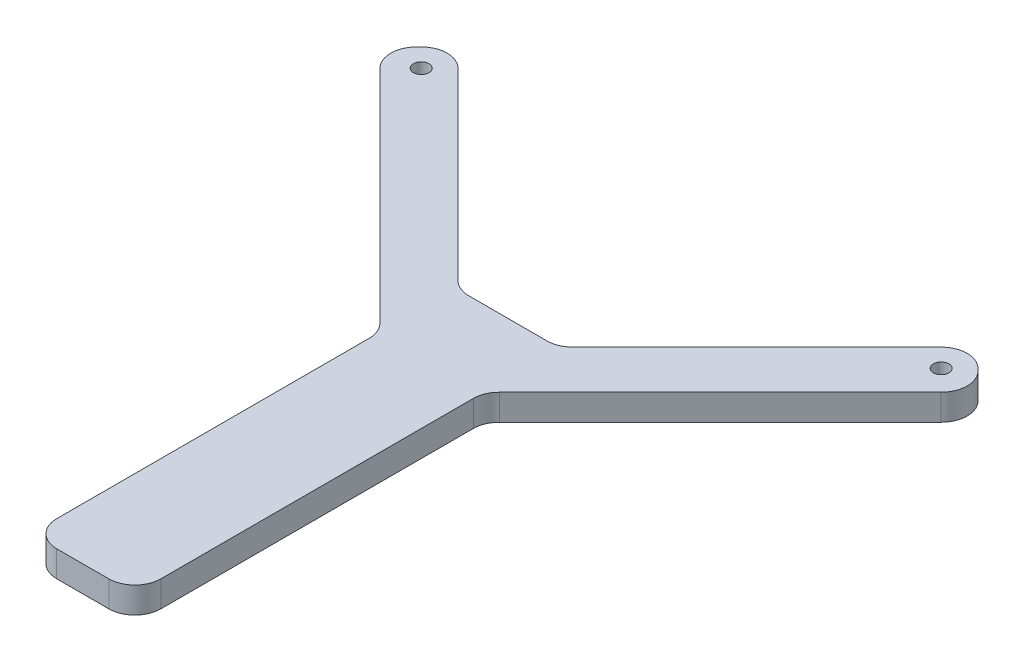
ISO-10303-21;
HEADER;
FILE_DESCRIPTION(('STEP AP214'),'2;1');
FILE_NAME('part.step','',(''),(''),'','','');
FILE_SCHEMA(('AUTOMOTIVE_DESIGN { 1 0 10303 214 1 1 1 1 }'));
ENDSEC;
DATA;
#1=APPLICATION_CONTEXT('core data for automotive mechanical design processes');
#2=APPLICATION_PROTOCOL_DEFINITION('international standard','automotive_design',2000,#1);
#3=PRODUCT_CONTEXT('',#1,'mechanical');
#4=PRODUCT('Part','Part','',(#3));
#5=PRODUCT_RELATED_PRODUCT_CATEGORY('part','',(#4));
#6=PRODUCT_DEFINITION_FORMATION('','',#4);
#7=PRODUCT_DEFINITION_CONTEXT('part definition',#1,'design');
#8=PRODUCT_DEFINITION('design','',#6,#7);
#9=PRODUCT_DEFINITION_SHAPE('','',#8);
#10=(LENGTH_UNIT() NAMED_UNIT(*) SI_UNIT(.MILLI.,.METRE.));
#11=(NAMED_UNIT(*) PLANE_ANGLE_UNIT() SI_UNIT($,.RADIAN.));
#12=(NAMED_UNIT(*) SI_UNIT($,.STERADIAN.) SOLID_ANGLE_UNIT());
#13=UNCERTAINTY_MEASURE_WITH_UNIT(LENGTH_MEASURE(1.E-05),#10,'distance_accuracy_value','');
#14=(GEOMETRIC_REPRESENTATION_CONTEXT(3) GLOBAL_UNCERTAINTY_ASSIGNED_CONTEXT((#13)) GLOBAL_UNIT_ASSIGNED_CONTEXT((#10,
#11,#12)) REPRESENTATION_CONTEXT('',''));
#15=CARTESIAN_POINT('',(0.,0.,0.));
#16=DIRECTION('',(0.,0.,1.));
#17=DIRECTION('',(1.,0.,0.));
#18=AXIS2_PLACEMENT_3D('',#15,#16,#17);
#19=CARTESIAN_POINT('',(44.45,12.7,-49.7105122421383));
#20=DIRECTION('',(0.,1.,0.));
#21=DIRECTION('',(0.,0.,1.));
#22=AXIS2_PLACEMENT_3D('',#19,#20,#21);
#23=PLANE('',#22);
#24=CARTESIAN_POINT('',(152.21307345283,12.7,-121.552561210692));
#25=DIRECTION('',(0.,1.,0.));
#26=DIRECTION('',(0.,0.,1.));
#27=AXIS2_PLACEMENT_3D('',#24,#25,#26);
#28=CIRCLE('',#27,3.81000000000001);
#29=CARTESIAN_POINT('',(152.21307345283,12.7,-117.742561210692));
#30=VERTEX_POINT('',#29);
#31=EDGE_CURVE('E206',#30,#30,#28,.T.);
#32=ORIENTED_EDGE('',*,*,#31,.F.);
#33=EDGE_LOOP('',(#32));
#34=FACE_BOUND('',#33,.T.);
#35=CARTESIAN_POINT('',(44.45,12.7,-49.7105122421383));
#36=DIRECTION('',(0.,-1.,0.));
#37=DIRECTION('',(0.,0.,1.));
#38=AXIS2_PLACEMENT_3D('',#35,#36,#37);
#39=CIRCLE('',#38,12.7);
#40=CARTESIAN_POINT('',(53.4302561210691,12.7,-40.7302561210691));
#41=VERTEX_POINT('',#40);
#42=CARTESIAN_POINT('',(44.45,12.7,-37.0105122421383));
#43=VERTEX_POINT('',#42);
#44=EDGE_CURVE('E241',#41,#43,#39,.T.);
#45=ORIENTED_EDGE('',*,*,#44,.T.);
#46=DIRECTION('',(-1.,0.,0.));
#47=VECTOR('',#46,1.);
#48=CARTESIAN_POINT('',(6.34999999999997,12.7,-37.0105122421383));
#49=LINE('',#48,#47);
#50=CARTESIAN_POINT('',(6.34999999999997,12.7,-37.0105122421383));
#51=VERTEX_POINT('',#50);
#52=EDGE_CURVE('E129',#43,#51,#49,.T.);
#53=ORIENTED_EDGE('',*,*,#52,.T.);
#54=CARTESIAN_POINT('',(6.34999999999997,12.7,-49.7105122421383));
#55=DIRECTION('',(0.,-1.,0.));
#56=DIRECTION('',(0.,0.,-1.));
#57=AXIS2_PLACEMENT_3D('',#54,#55,#56);
#58=CIRCLE('',#57,12.7);
#59=CARTESIAN_POINT('',(-2.6302561210692,12.7,-40.7302561210691));
#60=VERTEX_POINT('',#59);
#61=EDGE_CURVE('E292',#51,#60,#58,.T.);
#62=ORIENTED_EDGE('',*,*,#61,.T.);
#63=DIRECTION('',(-0.707106781186547,0.,-0.707106781186548));
#64=VECTOR('',#63,1.);
#65=CARTESIAN_POINT('',(-92.4328173317607,12.7,-130.532817331761));
#66=LINE('',#65,#64);
#67=CARTESIAN_POINT('',(-92.4328173317607,12.7,-130.532817331761));
#68=VERTEX_POINT('',#67);
#69=EDGE_CURVE('E311',#60,#68,#66,.T.);
#70=ORIENTED_EDGE('',*,*,#69,.T.);
#71=CARTESIAN_POINT('',(-101.41307345283,12.7,-121.552561210692));
#72=DIRECTION('',(0.,1.,0.));
#73=DIRECTION('',(0.,0.,1.));
#74=AXIS2_PLACEMENT_3D('',#71,#72,#73);
#75=CIRCLE('',#74,12.7);
#76=CARTESIAN_POINT('',(-110.393329573899,12.7,-130.532817331761));
#77=VERTEX_POINT('',#76);
#78=EDGE_CURVE('E308',#68,#77,#75,.T.);
#79=ORIENTED_EDGE('',*,*,#78,.T.);
#80=DIRECTION('',(-0.70710678118657,0.,0.707106781186525));
#81=VECTOR('',#80,1.);
#82=CARTESIAN_POINT('',(-111.482817331761,12.7,-129.443329573899));
#83=LINE('',#82,#81);
#84=CARTESIAN_POINT('',(-111.482817331761,12.7,-129.443329573899));
#85=VERTEX_POINT('',#84);
#86=EDGE_CURVE('E310',#77,#85,#83,.T.);
#87=ORIENTED_EDGE('',*,*,#86,.T.);
#88=CARTESIAN_POINT('',(-102.502561210692,12.7,-120.46307345283));
#89=DIRECTION('',(0.,1.,0.));
#90=DIRECTION('',(0.,0.,-1.));
#91=AXIS2_PLACEMENT_3D('',#88,#89,#90);
#92=CIRCLE('',#91,12.7);
#93=CARTESIAN_POINT('',(-111.482817331761,12.7,-111.482817331761));
#94=VERTEX_POINT('',#93);
#95=EDGE_CURVE('E313',#85,#94,#92,.T.);
#96=ORIENTED_EDGE('',*,*,#95,.T.);
#97=DIRECTION('',(0.707106781186547,0.,0.707106781186548));
#98=VECTOR('',#97,1.);
#99=CARTESIAN_POINT('',(-3.71974387893093,12.7,-3.71974387893089));
#100=LINE('',#99,#98);
#101=CARTESIAN_POINT('',(-3.71974387893093,12.7,-3.71974387893089));
#102=VERTEX_POINT('',#101);
#103=EDGE_CURVE('E319',#94,#102,#100,.T.);
#104=ORIENTED_EDGE('',*,*,#103,.T.);
#105=CARTESIAN_POINT('',(-12.7,12.7,5.26051224213835));
#106=DIRECTION('',(0.,-1.,0.));
#107=DIRECTION('',(0.,0.,1.));
#108=AXIS2_PLACEMENT_3D('',#105,#106,#107);
#109=CIRCLE('',#108,12.7);
#110=CARTESIAN_POINT('',(0.,12.7,5.2605122421384));
#111=VERTEX_POINT('',#110);
#112=EDGE_CURVE('E321',#102,#111,#109,.T.);
#113=ORIENTED_EDGE('',*,*,#112,.T.);
#114=DIRECTION('',(0.,0.,1.));
#115=VECTOR('',#114,1.);
#116=CARTESIAN_POINT('',(0.,12.7,5.2605122421384));
#117=LINE('',#116,#115);
#118=CARTESIAN_POINT('',(0.,12.7,157.660512242138));
#119=VERTEX_POINT('',#118);
#120=EDGE_CURVE('E323',#111,#119,#117,.T.);
#121=ORIENTED_EDGE('',*,*,#120,.T.);
#122=CARTESIAN_POINT('',(12.7,12.7,157.660512242138));
#123=DIRECTION('',(0.,1.,0.));
#124=DIRECTION('',(0.,0.,-1.));
#125=AXIS2_PLACEMENT_3D('',#122,#123,#124);
#126=CIRCLE('',#125,12.7);
#127=CARTESIAN_POINT('',(12.7,12.7,170.360512242138));
#128=VERTEX_POINT('',#127);
#129=EDGE_CURVE('E325',#119,#128,#126,.T.);
#130=ORIENTED_EDGE('',*,*,#129,.T.);
#131=DIRECTION('',(1.,0.,0.));
#132=VECTOR('',#131,1.);
#133=CARTESIAN_POINT('',(12.7,12.7,170.360512242138));
#134=LINE('',#133,#132);
#135=CARTESIAN_POINT('',(38.1,12.7,170.360512242138));
#136=VERTEX_POINT('',#135);
#137=EDGE_CURVE('E327',#128,#136,#134,.T.);
#138=ORIENTED_EDGE('',*,*,#137,.T.);
#139=CARTESIAN_POINT('',(38.1,12.7,157.660512242138));
#140=DIRECTION('',(0.,1.,0.));
#141=DIRECTION('',(0.,0.,-1.));
#142=AXIS2_PLACEMENT_3D('',#139,#140,#141);
#143=CIRCLE('',#142,12.7);
#144=CARTESIAN_POINT('',(50.8,12.7,157.660512242138));
#145=VERTEX_POINT('',#144);
#146=EDGE_CURVE('E329',#136,#145,#143,.T.);
#147=ORIENTED_EDGE('',*,*,#146,.T.);
#148=DIRECTION('',(0.,0.,-1.));
#149=VECTOR('',#148,1.);
#150=CARTESIAN_POINT('',(50.8,12.7,157.660512242138));
#151=LINE('',#150,#149);
#152=CARTESIAN_POINT('',(50.8,12.7,5.26051224213833));
#153=VERTEX_POINT('',#152);
#154=EDGE_CURVE('E331',#145,#153,#151,.T.);
#155=ORIENTED_EDGE('',*,*,#154,.T.);
#156=CARTESIAN_POINT('',(63.5,12.7,5.26051224213833));
#157=DIRECTION('',(0.,-1.,0.));
#158=DIRECTION('',(0.,0.,1.));
#159=AXIS2_PLACEMENT_3D('',#156,#157,#158);
#160=CIRCLE('',#159,12.7);
#161=CARTESIAN_POINT('',(54.5197438789308,12.7,-3.7197438789308));
#162=VERTEX_POINT('',#161);
#163=EDGE_CURVE('E333',#153,#162,#160,.T.);
#164=ORIENTED_EDGE('',*,*,#163,.T.);
#165=DIRECTION('',(0.707106781186547,0.,-0.707106781186547));
#166=VECTOR('',#165,1.);
#167=CARTESIAN_POINT('',(162.282817331761,12.7,-111.482817331761));
#168=LINE('',#167,#166);
#169=CARTESIAN_POINT('',(162.282817331761,12.7,-111.482817331761));
#170=VERTEX_POINT('',#169);
#171=EDGE_CURVE('E335',#162,#170,#168,.T.);
#172=ORIENTED_EDGE('',*,*,#171,.T.);
#173=CARTESIAN_POINT('',(153.302561210692,12.7,-120.46307345283));
#174=DIRECTION('',(0.,1.,0.));
#175=DIRECTION('',(0.,0.,-1.));
#176=AXIS2_PLACEMENT_3D('',#173,#174,#175);
#177=CIRCLE('',#176,12.7);
#178=CARTESIAN_POINT('',(162.282817331761,12.7,-129.443329573899));
#179=VERTEX_POINT('',#178);
#180=EDGE_CURVE('E184',#170,#179,#177,.T.);
#181=ORIENTED_EDGE('',*,*,#180,.T.);
#182=DIRECTION('',(-0.707106781186547,0.,-0.707106781186547));
#183=VECTOR('',#182,1.);
#184=CARTESIAN_POINT('',(161.193329573899,12.7,-130.532817331761));
#185=LINE('',#184,#183);
#186=CARTESIAN_POINT('',(161.193329573899,12.7,-130.532817331761));
#187=VERTEX_POINT('',#186);
#188=EDGE_CURVE('E178',#179,#187,#185,.T.);
#189=ORIENTED_EDGE('',*,*,#188,.T.);
#190=CARTESIAN_POINT('',(152.21307345283,12.7,-121.552561210692));
#191=DIRECTION('',(0.,1.,0.));
#192=DIRECTION('',(0.,0.,-1.));
#193=AXIS2_PLACEMENT_3D('',#190,#191,#192);
#194=CIRCLE('',#193,12.7);
#195=CARTESIAN_POINT('',(143.232817331761,12.7,-130.532817331761));
#196=VERTEX_POINT('',#195);
#197=EDGE_CURVE('E182',#187,#196,#194,.T.);
#198=ORIENTED_EDGE('',*,*,#197,.T.);
#199=DIRECTION('',(-0.707106781186548,0.,0.707106781186548));
#200=VECTOR('',#199,1.);
#201=CARTESIAN_POINT('',(53.4302561210691,12.7,-40.7302561210691));
#202=LINE('',#201,#200);
#203=EDGE_CURVE('E50',#196,#41,#202,.T.);
#204=ORIENTED_EDGE('',*,*,#203,.T.);
#205=EDGE_LOOP('',(#45,#53,#62,#70,#79,#87,#96,#104,#113,#121,#130,#138,#147,#155,#164,#172,
#181,#189,#198,#204));
#206=FACE_BOUND('',#205,.T.);
#207=CARTESIAN_POINT('',(-101.41307345283,12.7,-121.552561210692));
#208=DIRECTION('',(0.,1.,0.));
#209=DIRECTION('',(0.,0.,1.));
#210=AXIS2_PLACEMENT_3D('',#207,#208,#209);
#211=CIRCLE('',#210,3.81);
#212=CARTESIAN_POINT('',(-101.41307345283,12.7,-117.742561210692));
#213=VERTEX_POINT('',#212);
#214=EDGE_CURVE('E378',#213,#213,#211,.T.);
#215=ORIENTED_EDGE('',*,*,#214,.F.);
#216=EDGE_LOOP('',(#215));
#217=FACE_BOUND('',#216,.T.);
#218=ADVANCED_FACE('F33',(#34,#206,#217),#23,.T.);
#219=CARTESIAN_POINT('',(44.45,0.,-49.7105122421383));
#220=DIRECTION('',(0.,1.,0.));
#221=DIRECTION('',(0.,0.,1.));
#222=AXIS2_PLACEMENT_3D('',#219,#220,#221);
#223=PLANE('',#222);
#224=CARTESIAN_POINT('',(152.21307345283,0.,-121.552561210692));
#225=DIRECTION('',(0.,1.,0.));
#226=DIRECTION('',(0.,0.,1.));
#227=AXIS2_PLACEMENT_3D('',#224,#225,#226);
#228=CIRCLE('',#227,3.81000000000001);
#229=CARTESIAN_POINT('',(152.21307345283,0.,-117.742561210692));
#230=VERTEX_POINT('',#229);
#231=EDGE_CURVE('E383',#230,#230,#228,.T.);
#232=ORIENTED_EDGE('',*,*,#231,.T.);
#233=EDGE_LOOP('',(#232));
#234=FACE_BOUND('',#233,.T.);
#235=CARTESIAN_POINT('',(44.45,0.,-49.7105122421383));
#236=DIRECTION('',(0.,-1.,0.));
#237=DIRECTION('',(0.,0.,1.));
#238=AXIS2_PLACEMENT_3D('',#235,#236,#237);
#239=CIRCLE('',#238,12.7);
#240=CARTESIAN_POINT('',(53.4302561210691,0.,-40.7302561210691));
#241=VERTEX_POINT('',#240);
#242=CARTESIAN_POINT('',(44.45,0.,-37.0105122421383));
#243=VERTEX_POINT('',#242);
#244=EDGE_CURVE('E202',#241,#243,#239,.T.);
#245=ORIENTED_EDGE('',*,*,#244,.F.);
#246=DIRECTION('',(-0.707106781186548,0.,0.707106781186548));
#247=VECTOR('',#246,1.);
#248=CARTESIAN_POINT('',(53.4302561210691,0.,-40.7302561210691));
#249=LINE('',#248,#247);
#250=CARTESIAN_POINT('',(143.232817331761,0.,-130.532817331761));
#251=VERTEX_POINT('',#250);
#252=EDGE_CURVE('E121',#251,#241,#249,.T.);
#253=ORIENTED_EDGE('',*,*,#252,.F.);
#254=CARTESIAN_POINT('',(152.21307345283,0.,-121.552561210692));
#255=DIRECTION('',(0.,1.,0.));
#256=DIRECTION('',(0.,0.,-1.));
#257=AXIS2_PLACEMENT_3D('',#254,#255,#256);
#258=CIRCLE('',#257,12.7);
#259=CARTESIAN_POINT('',(161.193329573899,0.,-130.532817331761));
#260=VERTEX_POINT('',#259);
#261=EDGE_CURVE('E115',#260,#251,#258,.T.);
#262=ORIENTED_EDGE('',*,*,#261,.F.);
#263=DIRECTION('',(-0.707106781186547,0.,-0.707106781186547));
#264=VECTOR('',#263,1.);
#265=CARTESIAN_POINT('',(161.193329573899,0.,-130.532817331761));
#266=LINE('',#265,#264);
#267=CARTESIAN_POINT('',(162.282817331761,0.,-129.443329573899));
#268=VERTEX_POINT('',#267);
#269=EDGE_CURVE('E192',#268,#260,#266,.T.);
#270=ORIENTED_EDGE('',*,*,#269,.F.);
#271=CARTESIAN_POINT('',(153.302561210692,0.,-120.46307345283));
#272=DIRECTION('',(0.,1.,0.));
#273=DIRECTION('',(0.,0.,-1.));
#274=AXIS2_PLACEMENT_3D('',#271,#272,#273);
#275=CIRCLE('',#274,12.7);
#276=CARTESIAN_POINT('',(162.282817331761,0.,-111.482817331761));
#277=VERTEX_POINT('',#276);
#278=EDGE_CURVE('E236',#277,#268,#275,.T.);
#279=ORIENTED_EDGE('',*,*,#278,.F.);
#280=DIRECTION('',(0.707106781186547,0.,-0.707106781186547));
#281=VECTOR('',#280,1.);
#282=CARTESIAN_POINT('',(162.282817331761,0.,-111.482817331761));
#283=LINE('',#282,#281);
#284=CARTESIAN_POINT('',(54.5197438789308,0.,-3.7197438789308));
#285=VERTEX_POINT('',#284);
#286=EDGE_CURVE('E234',#285,#277,#283,.T.);
#287=ORIENTED_EDGE('',*,*,#286,.F.);
#288=CARTESIAN_POINT('',(63.5,0.,5.26051224213833));
#289=DIRECTION('',(0.,-1.,0.));
#290=DIRECTION('',(0.,0.,1.));
#291=AXIS2_PLACEMENT_3D('',#288,#289,#290);
#292=CIRCLE('',#291,12.7);
#293=CARTESIAN_POINT('',(50.8,0.,5.26051224213833));
#294=VERTEX_POINT('',#293);
#295=EDGE_CURVE('E232',#294,#285,#292,.T.);
#296=ORIENTED_EDGE('',*,*,#295,.F.);
#297=DIRECTION('',(0.,0.,-1.));
#298=VECTOR('',#297,1.);
#299=CARTESIAN_POINT('',(50.8,0.,157.660512242138));
#300=LINE('',#299,#298);
#301=CARTESIAN_POINT('',(50.8,0.,157.660512242138));
#302=VERTEX_POINT('',#301);
#303=EDGE_CURVE('E230',#302,#294,#300,.T.);
#304=ORIENTED_EDGE('',*,*,#303,.F.);
#305=CARTESIAN_POINT('',(38.1,0.,157.660512242138));
#306=DIRECTION('',(0.,1.,0.));
#307=DIRECTION('',(0.,0.,-1.));
#308=AXIS2_PLACEMENT_3D('',#305,#306,#307);
#309=CIRCLE('',#308,12.7);
#310=CARTESIAN_POINT('',(38.1,0.,170.360512242138));
#311=VERTEX_POINT('',#310);
#312=EDGE_CURVE('E228',#311,#302,#309,.T.);
#313=ORIENTED_EDGE('',*,*,#312,.F.);
#314=DIRECTION('',(1.,0.,0.));
#315=VECTOR('',#314,1.);
#316=CARTESIAN_POINT('',(12.7,0.,170.360512242138));
#317=LINE('',#316,#315);
#318=CARTESIAN_POINT('',(12.7,0.,170.360512242138));
#319=VERTEX_POINT('',#318);
#320=EDGE_CURVE('E226',#319,#311,#317,.T.);
#321=ORIENTED_EDGE('',*,*,#320,.F.);
#322=CARTESIAN_POINT('',(12.7,0.,157.660512242138));
#323=DIRECTION('',(0.,1.,0.));
#324=DIRECTION('',(0.,0.,-1.));
#325=AXIS2_PLACEMENT_3D('',#322,#323,#324);
#326=CIRCLE('',#325,12.7);
#327=CARTESIAN_POINT('',(0.,0.,157.660512242138));
#328=VERTEX_POINT('',#327);
#329=EDGE_CURVE('E224',#328,#319,#326,.T.);
#330=ORIENTED_EDGE('',*,*,#329,.F.);
#331=DIRECTION('',(0.,0.,1.));
#332=VECTOR('',#331,1.);
#333=CARTESIAN_POINT('',(0.,0.,5.2605122421384));
#334=LINE('',#333,#332);
#335=CARTESIAN_POINT('',(0.,0.,5.2605122421384));
#336=VERTEX_POINT('',#335);
#337=EDGE_CURVE('E222',#336,#328,#334,.T.);
#338=ORIENTED_EDGE('',*,*,#337,.F.);
#339=CARTESIAN_POINT('',(-12.7,0.,5.26051224213835));
#340=DIRECTION('',(0.,-1.,0.));
#341=DIRECTION('',(0.,0.,1.));
#342=AXIS2_PLACEMENT_3D('',#339,#340,#341);
#343=CIRCLE('',#342,12.7);
#344=CARTESIAN_POINT('',(-3.71974387893093,0.,-3.71974387893089));
#345=VERTEX_POINT('',#344);
#346=EDGE_CURVE('E220',#345,#336,#343,.T.);
#347=ORIENTED_EDGE('',*,*,#346,.F.);
#348=DIRECTION('',(0.707106781186547,0.,0.707106781186548));
#349=VECTOR('',#348,1.);
#350=CARTESIAN_POINT('',(-3.71974387893093,0.,-3.71974387893089));
#351=LINE('',#350,#349);
#352=CARTESIAN_POINT('',(-111.482817331761,0.,-111.482817331761));
#353=VERTEX_POINT('',#352);
#354=EDGE_CURVE('E218',#353,#345,#351,.T.);
#355=ORIENTED_EDGE('',*,*,#354,.F.);
#356=CARTESIAN_POINT('',(-102.502561210692,0.,-120.46307345283));
#357=DIRECTION('',(0.,1.,0.));
#358=DIRECTION('',(0.,0.,-1.));
#359=AXIS2_PLACEMENT_3D('',#356,#357,#358);
#360=CIRCLE('',#359,12.7);
#361=CARTESIAN_POINT('',(-111.482817331761,0.,-129.443329573899));
#362=VERTEX_POINT('',#361);
#363=EDGE_CURVE('E216',#362,#353,#360,.T.);
#364=ORIENTED_EDGE('',*,*,#363,.F.);
#365=DIRECTION('',(-0.70710678118657,0.,0.707106781186525));
#366=VECTOR('',#365,1.);
#367=CARTESIAN_POINT('',(-111.482817331761,0.,-129.443329573899));
#368=LINE('',#367,#366);
#369=CARTESIAN_POINT('',(-110.393329573899,0.,-130.532817331761));
#370=VERTEX_POINT('',#369);
#371=EDGE_CURVE('E214',#370,#362,#368,.T.);
#372=ORIENTED_EDGE('',*,*,#371,.F.);
#373=CARTESIAN_POINT('',(-101.41307345283,0.,-121.552561210692));
#374=DIRECTION('',(0.,1.,0.));
#375=DIRECTION('',(0.,0.,1.));
#376=AXIS2_PLACEMENT_3D('',#373,#374,#375);
#377=CIRCLE('',#376,12.7);
#378=CARTESIAN_POINT('',(-92.4328173317607,0.,-130.532817331761));
#379=VERTEX_POINT('',#378);
#380=EDGE_CURVE('E212',#379,#370,#377,.T.);
#381=ORIENTED_EDGE('',*,*,#380,.F.);
#382=DIRECTION('',(-0.707106781186547,0.,-0.707106781186548));
#383=VECTOR('',#382,1.);
#384=CARTESIAN_POINT('',(-92.4328173317607,0.,-130.532817331761));
#385=LINE('',#384,#383);
#386=CARTESIAN_POINT('',(-2.6302561210692,0.,-40.7302561210691));
#387=VERTEX_POINT('',#386);
#388=EDGE_CURVE('E210',#387,#379,#385,.T.);
#389=ORIENTED_EDGE('',*,*,#388,.F.);
#390=CARTESIAN_POINT('',(6.34999999999997,0.,-49.7105122421383));
#391=DIRECTION('',(0.,-1.,0.));
#392=DIRECTION('',(0.,0.,-1.));
#393=AXIS2_PLACEMENT_3D('',#390,#391,#392);
#394=CIRCLE('',#393,12.7);
#395=CARTESIAN_POINT('',(6.34999999999997,0.,-37.0105122421383));
#396=VERTEX_POINT('',#395);
#397=EDGE_CURVE('E208',#396,#387,#394,.T.);
#398=ORIENTED_EDGE('',*,*,#397,.F.);
#399=DIRECTION('',(-1.,0.,0.));
#400=VECTOR('',#399,1.);
#401=CARTESIAN_POINT('',(6.34999999999997,0.,-37.0105122421383));
#402=LINE('',#401,#400);
#403=EDGE_CURVE('E205',#243,#396,#402,.T.);
#404=ORIENTED_EDGE('',*,*,#403,.F.);
#405=EDGE_LOOP('',(#245,#253,#262,#270,#279,#287,#296,#304,#313,#321,#330,#338,#347,#355,#364,
#372,#381,#389,#398,#404));
#406=FACE_BOUND('',#405,.T.);
#407=CARTESIAN_POINT('',(-101.41307345283,0.,-121.552561210692));
#408=DIRECTION('',(0.,1.,0.));
#409=DIRECTION('',(0.,0.,1.));
#410=AXIS2_PLACEMENT_3D('',#407,#408,#409);
#411=CIRCLE('',#410,3.81);
#412=CARTESIAN_POINT('',(-101.41307345283,0.,-117.742561210692));
#413=VERTEX_POINT('',#412);
#414=EDGE_CURVE('E381',#413,#413,#411,.T.);
#415=ORIENTED_EDGE('',*,*,#414,.T.);
#416=EDGE_LOOP('',(#415));
#417=FACE_BOUND('',#416,.T.);
#418=ADVANCED_FACE('F296',(#234,#406,#417),#223,.F.);
#419=CARTESIAN_POINT('',(44.45,12.7,-49.7105122421383));
#420=DIRECTION('',(0.,-1.,0.));
#421=DIRECTION('',(0.,0.,-1.));
#422=AXIS2_PLACEMENT_3D('',#419,#420,#421);
#423=CYLINDRICAL_SURFACE('',#422,12.7);
#424=ORIENTED_EDGE('',*,*,#244,.T.);
#425=DIRECTION('',(0.,-1.,0.));
#426=VECTOR('',#425,1.);
#427=CARTESIAN_POINT('',(44.45,12.7,-37.0105122421383));
#428=LINE('',#427,#426);
#429=EDGE_CURVE('E11',#43,#243,#428,.T.);
#430=ORIENTED_EDGE('',*,*,#429,.F.);
#431=ORIENTED_EDGE('',*,*,#44,.F.);
#432=DIRECTION('',(0.,-1.,0.));
#433=VECTOR('',#432,1.);
#434=CARTESIAN_POINT('',(53.4302561210691,12.7,-40.7302561210691));
#435=LINE('',#434,#433);
#436=EDGE_CURVE('E198',#41,#241,#435,.T.);
#437=ORIENTED_EDGE('',*,*,#436,.T.);
#438=EDGE_LOOP('',(#424,#430,#431,#437));
#439=FACE_BOUND('',#438,.T.);
#440=ADVANCED_FACE('F35',(#439),#423,.F.);
#441=CARTESIAN_POINT('',(6.34999999999997,12.7,-37.0105122421383));
#442=DIRECTION('',(0.,0.,1.));
#443=DIRECTION('',(1.,0.,0.));
#444=AXIS2_PLACEMENT_3D('',#441,#442,#443);
#445=PLANE('',#444);
#446=ORIENTED_EDGE('',*,*,#403,.T.);
#447=DIRECTION('',(0.,-1.,0.));
#448=VECTOR('',#447,1.);
#449=CARTESIAN_POINT('',(6.34999999999997,12.7,-37.0105122421383));
#450=LINE('',#449,#448);
#451=EDGE_CURVE('E42',#51,#396,#450,.T.);
#452=ORIENTED_EDGE('',*,*,#451,.F.);
#453=ORIENTED_EDGE('',*,*,#52,.F.);
#454=ORIENTED_EDGE('',*,*,#429,.T.);
#455=EDGE_LOOP('',(#446,#452,#453,#454));
#456=FACE_BOUND('',#455,.T.);
#457=ADVANCED_FACE('F556',(#456),#445,.F.);
#458=CARTESIAN_POINT('',(6.34999999999997,12.7,-49.7105122421383));
#459=DIRECTION('',(0.,-1.,0.));
#460=DIRECTION('',(0.,0.,-1.));
#461=AXIS2_PLACEMENT_3D('',#458,#459,#460);
#462=CYLINDRICAL_SURFACE('',#461,12.7);
#463=ORIENTED_EDGE('',*,*,#397,.T.);
#464=DIRECTION('',(0.,-1.,0.));
#465=VECTOR('',#464,1.);
#466=CARTESIAN_POINT('',(-2.6302561210692,12.7,-40.7302561210691));
#467=LINE('',#466,#465);
#468=EDGE_CURVE('E284',#60,#387,#467,.T.);
#469=ORIENTED_EDGE('',*,*,#468,.F.);
#470=ORIENTED_EDGE('',*,*,#61,.F.);
#471=ORIENTED_EDGE('',*,*,#451,.T.);
#472=EDGE_LOOP('',(#463,#469,#470,#471));
#473=FACE_BOUND('',#472,.T.);
#474=ADVANCED_FACE('F290',(#473),#462,.F.);
#475=CARTESIAN_POINT('',(-92.4328173317607,12.7,-130.532817331761));
#476=DIRECTION('',(-0.707106781186548,0.,0.707106781186547));
#477=DIRECTION('',(0.707106781186547,0.,0.707106781186548));
#478=AXIS2_PLACEMENT_3D('',#475,#476,#477);
#479=PLANE('',#478);
#480=ORIENTED_EDGE('',*,*,#388,.T.);
#481=DIRECTION('',(0.,-1.,0.));
#482=VECTOR('',#481,1.);
#483=CARTESIAN_POINT('',(-92.4328173317607,12.7,-130.532817331761));
#484=LINE('',#483,#482);
#485=EDGE_CURVE('E281',#68,#379,#484,.T.);
#486=ORIENTED_EDGE('',*,*,#485,.F.);
#487=ORIENTED_EDGE('',*,*,#69,.F.);
#488=ORIENTED_EDGE('',*,*,#468,.T.);
#489=EDGE_LOOP('',(#480,#486,#487,#488));
#490=FACE_BOUND('',#489,.T.);
#491=ADVANCED_FACE('F302',(#490),#479,.F.);
#492=CARTESIAN_POINT('',(-101.41307345283,12.7,-121.552561210692));
#493=DIRECTION('',(0.,-1.,0.));
#494=DIRECTION('',(0.,0.,-1.));
#495=AXIS2_PLACEMENT_3D('',#492,#493,#494);
#496=CYLINDRICAL_SURFACE('',#495,12.7);
#497=ORIENTED_EDGE('',*,*,#380,.T.);
#498=DIRECTION('',(0.,-1.,0.));
#499=VECTOR('',#498,1.);
#500=CARTESIAN_POINT('',(-110.393329573899,12.7,-130.532817331761));
#501=LINE('',#500,#499);
#502=EDGE_CURVE('E278',#77,#370,#501,.T.);
#503=ORIENTED_EDGE('',*,*,#502,.F.);
#504=ORIENTED_EDGE('',*,*,#78,.F.);
#505=ORIENTED_EDGE('',*,*,#485,.T.);
#506=EDGE_LOOP('',(#497,#503,#504,#505));
#507=FACE_BOUND('',#506,.T.);
#508=ADVANCED_FACE('F306',(#507),#496,.T.);
#509=CARTESIAN_POINT('',(-111.482817331761,12.7,-129.443329573899));
#510=DIRECTION('',(0.707106781186525,0.,0.70710678118657));
#511=DIRECTION('',(0.70710678118657,0.,-0.707106781186525));
#512=AXIS2_PLACEMENT_3D('',#509,#510,#511);
#513=PLANE('',#512);
#514=ORIENTED_EDGE('',*,*,#371,.T.);
#515=DIRECTION('',(0.,-1.,0.));
#516=VECTOR('',#515,1.);
#517=CARTESIAN_POINT('',(-111.482817331761,12.7,-129.443329573899));
#518=LINE('',#517,#516);
#519=EDGE_CURVE('E275',#85,#362,#518,.T.);
#520=ORIENTED_EDGE('',*,*,#519,.F.);
#521=ORIENTED_EDGE('',*,*,#86,.F.);
#522=ORIENTED_EDGE('',*,*,#502,.T.);
#523=EDGE_LOOP('',(#514,#520,#521,#522));
#524=FACE_BOUND('',#523,.T.);
#525=ADVANCED_FACE('F521',(#524),#513,.F.);
#526=CARTESIAN_POINT('',(-102.502561210692,12.7,-120.46307345283));
#527=DIRECTION('',(0.,-1.,0.));
#528=DIRECTION('',(0.,0.,-1.));
#529=AXIS2_PLACEMENT_3D('',#526,#527,#528);
#530=CYLINDRICAL_SURFACE('',#529,12.7);
#531=ORIENTED_EDGE('',*,*,#363,.T.);
#532=DIRECTION('',(0.,-1.,0.));
#533=VECTOR('',#532,1.);
#534=CARTESIAN_POINT('',(-111.482817331761,12.7,-111.482817331761));
#535=LINE('',#534,#533);
#536=EDGE_CURVE('E272',#94,#353,#535,.T.);
#537=ORIENTED_EDGE('',*,*,#536,.F.);
#538=ORIENTED_EDGE('',*,*,#95,.F.);
#539=ORIENTED_EDGE('',*,*,#519,.T.);
#540=EDGE_LOOP('',(#531,#537,#538,#539));
#541=FACE_BOUND('',#540,.T.);
#542=ADVANCED_FACE('F511',(#541),#530,.T.);
#543=CARTESIAN_POINT('',(-3.71974387893093,12.7,-3.71974387893089));
#544=DIRECTION('',(0.707106781186548,0.,-0.707106781186547));
#545=DIRECTION('',(-0.707106781186547,0.,-0.707106781186548));
#546=AXIS2_PLACEMENT_3D('',#543,#544,#545);
#547=PLANE('',#546);
#548=ORIENTED_EDGE('',*,*,#354,.T.);
#549=DIRECTION('',(0.,-1.,0.));
#550=VECTOR('',#549,1.);
#551=CARTESIAN_POINT('',(-3.71974387893093,12.7,-3.71974387893089));
#552=LINE('',#551,#550);
#553=EDGE_CURVE('E269',#102,#345,#552,.T.);
#554=ORIENTED_EDGE('',*,*,#553,.F.);
#555=ORIENTED_EDGE('',*,*,#103,.F.);
#556=ORIENTED_EDGE('',*,*,#536,.T.);
#557=EDGE_LOOP('',(#548,#554,#555,#556));
#558=FACE_BOUND('',#557,.T.);
#559=ADVANCED_FACE('F501',(#558),#547,.F.);
#560=CARTESIAN_POINT('',(-12.7,12.7,5.26051224213835));
#561=DIRECTION('',(0.,-1.,0.));
#562=DIRECTION('',(0.,0.,-1.));
#563=AXIS2_PLACEMENT_3D('',#560,#561,#562);
#564=CYLINDRICAL_SURFACE('',#563,12.7);
#565=ORIENTED_EDGE('',*,*,#346,.T.);
#566=DIRECTION('',(0.,-1.,0.));
#567=VECTOR('',#566,1.);
#568=CARTESIAN_POINT('',(0.,12.7,5.2605122421384));
#569=LINE('',#568,#567);
#570=EDGE_CURVE('E266',#111,#336,#569,.T.);
#571=ORIENTED_EDGE('',*,*,#570,.F.);
#572=ORIENTED_EDGE('',*,*,#112,.F.);
#573=ORIENTED_EDGE('',*,*,#553,.T.);
#574=EDGE_LOOP('',(#565,#571,#572,#573));
#575=FACE_BOUND('',#574,.T.);
#576=ADVANCED_FACE('F491',(#575),#564,.F.);
#577=CARTESIAN_POINT('',(0.,12.7,5.2605122421384));
#578=DIRECTION('',(1.,0.,0.));
#579=DIRECTION('',(0.,0.,-1.));
#580=AXIS2_PLACEMENT_3D('',#577,#578,#579);
#581=PLANE('',#580);
#582=ORIENTED_EDGE('',*,*,#337,.T.);
#583=DIRECTION('',(0.,-1.,0.));
#584=VECTOR('',#583,1.);
#585=CARTESIAN_POINT('',(0.,12.7,157.660512242138));
#586=LINE('',#585,#584);
#587=EDGE_CURVE('E263',#119,#328,#586,.T.);
#588=ORIENTED_EDGE('',*,*,#587,.F.);
#589=ORIENTED_EDGE('',*,*,#120,.F.);
#590=ORIENTED_EDGE('',*,*,#570,.T.);
#591=EDGE_LOOP('',(#582,#588,#589,#590));
#592=FACE_BOUND('',#591,.T.);
#593=ADVANCED_FACE('F481',(#592),#581,.F.);
#594=CARTESIAN_POINT('',(12.7,12.7,157.660512242138));
#595=DIRECTION('',(0.,-1.,0.));
#596=DIRECTION('',(0.,0.,-1.));
#597=AXIS2_PLACEMENT_3D('',#594,#595,#596);
#598=CYLINDRICAL_SURFACE('',#597,12.7);
#599=ORIENTED_EDGE('',*,*,#329,.T.);
#600=DIRECTION('',(0.,-1.,0.));
#601=VECTOR('',#600,1.);
#602=CARTESIAN_POINT('',(12.7,12.7,170.360512242138));
#603=LINE('',#602,#601);
#604=EDGE_CURVE('E260',#128,#319,#603,.T.);
#605=ORIENTED_EDGE('',*,*,#604,.F.);
#606=ORIENTED_EDGE('',*,*,#129,.F.);
#607=ORIENTED_EDGE('',*,*,#587,.T.);
#608=EDGE_LOOP('',(#599,#605,#606,#607));
#609=FACE_BOUND('',#608,.T.);
#610=ADVANCED_FACE('F471',(#609),#598,.T.);
#611=CARTESIAN_POINT('',(12.7,12.7,170.360512242138));
#612=DIRECTION('',(0.,0.,-1.));
#613=DIRECTION('',(-1.,0.,0.));
#614=AXIS2_PLACEMENT_3D('',#611,#612,#613);
#615=PLANE('',#614);
#616=ORIENTED_EDGE('',*,*,#320,.T.);
#617=DIRECTION('',(0.,-1.,0.));
#618=VECTOR('',#617,1.);
#619=CARTESIAN_POINT('',(38.1,12.7,170.360512242138));
#620=LINE('',#619,#618);
#621=EDGE_CURVE('E257',#136,#311,#620,.T.);
#622=ORIENTED_EDGE('',*,*,#621,.F.);
#623=ORIENTED_EDGE('',*,*,#137,.F.);
#624=ORIENTED_EDGE('',*,*,#604,.T.);
#625=EDGE_LOOP('',(#616,#622,#623,#624));
#626=FACE_BOUND('',#625,.T.);
#627=ADVANCED_FACE('F461',(#626),#615,.F.);
#628=CARTESIAN_POINT('',(38.1,12.7,157.660512242138));
#629=DIRECTION('',(0.,-1.,0.));
#630=DIRECTION('',(0.,0.,-1.));
#631=AXIS2_PLACEMENT_3D('',#628,#629,#630);
#632=CYLINDRICAL_SURFACE('',#631,12.7);
#633=ORIENTED_EDGE('',*,*,#312,.T.);
#634=DIRECTION('',(0.,-1.,0.));
#635=VECTOR('',#634,1.);
#636=CARTESIAN_POINT('',(50.8,12.7,157.660512242138));
#637=LINE('',#636,#635);
#638=EDGE_CURVE('E254',#145,#302,#637,.T.);
#639=ORIENTED_EDGE('',*,*,#638,.F.);
#640=ORIENTED_EDGE('',*,*,#146,.F.);
#641=ORIENTED_EDGE('',*,*,#621,.T.);
#642=EDGE_LOOP('',(#633,#639,#640,#641));
#643=FACE_BOUND('',#642,.T.);
#644=ADVANCED_FACE('F451',(#643),#632,.T.);
#645=CARTESIAN_POINT('',(50.8,12.7,157.660512242138));
#646=DIRECTION('',(-1.,0.,0.));
#647=DIRECTION('',(0.,0.,1.));
#648=AXIS2_PLACEMENT_3D('',#645,#646,#647);
#649=PLANE('',#648);
#650=ORIENTED_EDGE('',*,*,#303,.T.);
#651=DIRECTION('',(0.,-1.,0.));
#652=VECTOR('',#651,1.);
#653=CARTESIAN_POINT('',(50.8,12.7,5.26051224213833));
#654=LINE('',#653,#652);
#655=EDGE_CURVE('E251',#153,#294,#654,.T.);
#656=ORIENTED_EDGE('',*,*,#655,.F.);
#657=ORIENTED_EDGE('',*,*,#154,.F.);
#658=ORIENTED_EDGE('',*,*,#638,.T.);
#659=EDGE_LOOP('',(#650,#656,#657,#658));
#660=FACE_BOUND('',#659,.T.);
#661=ADVANCED_FACE('F441',(#660),#649,.F.);
#662=CARTESIAN_POINT('',(63.5,12.7,5.26051224213833));
#663=DIRECTION('',(0.,-1.,0.));
#664=DIRECTION('',(0.,0.,-1.));
#665=AXIS2_PLACEMENT_3D('',#662,#663,#664);
#666=CYLINDRICAL_SURFACE('',#665,12.7);
#667=ORIENTED_EDGE('',*,*,#295,.T.);
#668=DIRECTION('',(0.,-1.,0.));
#669=VECTOR('',#668,1.);
#670=CARTESIAN_POINT('',(54.5197438789308,12.7,-3.7197438789308));
#671=LINE('',#670,#669);
#672=EDGE_CURVE('E248',#162,#285,#671,.T.);
#673=ORIENTED_EDGE('',*,*,#672,.F.);
#674=ORIENTED_EDGE('',*,*,#163,.F.);
#675=ORIENTED_EDGE('',*,*,#655,.T.);
#676=EDGE_LOOP('',(#667,#673,#674,#675));
#677=FACE_BOUND('',#676,.T.);
#678=ADVANCED_FACE('F432',(#677),#666,.F.);
#679=CARTESIAN_POINT('',(162.282817331761,12.7,-111.482817331761));
#680=DIRECTION('',(-0.707106781186548,0.,-0.707106781186548));
#681=DIRECTION('',(-0.707106781186548,0.,0.707106781186548));
#682=AXIS2_PLACEMENT_3D('',#679,#680,#681);
#683=PLANE('',#682);
#684=ORIENTED_EDGE('',*,*,#286,.T.);
#685=DIRECTION('',(0.,-1.,0.));
#686=VECTOR('',#685,1.);
#687=CARTESIAN_POINT('',(162.282817331761,12.7,-111.482817331761));
#688=LINE('',#687,#686);
#689=EDGE_CURVE('E245',#170,#277,#688,.T.);
#690=ORIENTED_EDGE('',*,*,#689,.F.);
#691=ORIENTED_EDGE('',*,*,#171,.F.);
#692=ORIENTED_EDGE('',*,*,#672,.T.);
#693=EDGE_LOOP('',(#684,#690,#691,#692));
#694=FACE_BOUND('',#693,.T.);
#695=ADVANCED_FACE('F341',(#694),#683,.F.);
#696=CARTESIAN_POINT('',(153.302561210692,12.7,-120.46307345283));
#697=DIRECTION('',(0.,-1.,0.));
#698=DIRECTION('',(0.,0.,-1.));
#699=AXIS2_PLACEMENT_3D('',#696,#697,#698);
#700=CYLINDRICAL_SURFACE('',#699,12.7);
#701=ORIENTED_EDGE('',*,*,#278,.T.);
#702=DIRECTION('',(0.,-1.,0.));
#703=VECTOR('',#702,1.);
#704=CARTESIAN_POINT('',(162.282817331761,12.7,-129.443329573899));
#705=LINE('',#704,#703);
#706=EDGE_CURVE('E193',#179,#268,#705,.T.);
#707=ORIENTED_EDGE('',*,*,#706,.F.);
#708=ORIENTED_EDGE('',*,*,#180,.F.);
#709=ORIENTED_EDGE('',*,*,#689,.T.);
#710=EDGE_LOOP('',(#701,#707,#708,#709));
#711=FACE_BOUND('',#710,.T.);
#712=ADVANCED_FACE('F345',(#711),#700,.T.);
#713=CARTESIAN_POINT('',(161.193329573899,12.7,-130.532817331761));
#714=DIRECTION('',(-0.707106781186548,0.,0.707106781186548));
#715=DIRECTION('',(0.707106781186548,0.,0.707106781186548));
#716=AXIS2_PLACEMENT_3D('',#713,#714,#715);
#717=PLANE('',#716);
#718=ORIENTED_EDGE('',*,*,#269,.T.);
#719=DIRECTION('',(0.,-1.,0.));
#720=VECTOR('',#719,1.);
#721=CARTESIAN_POINT('',(161.193329573899,12.7,-130.532817331761));
#722=LINE('',#721,#720);
#723=EDGE_CURVE('E189',#187,#260,#722,.T.);
#724=ORIENTED_EDGE('',*,*,#723,.F.);
#725=ORIENTED_EDGE('',*,*,#188,.F.);
#726=ORIENTED_EDGE('',*,*,#706,.T.);
#727=EDGE_LOOP('',(#718,#724,#725,#726));
#728=FACE_BOUND('',#727,.T.);
#729=ADVANCED_FACE('F190',(#728),#717,.F.);
#730=CARTESIAN_POINT('',(152.21307345283,12.7,-121.552561210692));
#731=DIRECTION('',(0.,-1.,0.));
#732=DIRECTION('',(0.,0.,-1.));
#733=AXIS2_PLACEMENT_3D('',#730,#731,#732);
#734=CYLINDRICAL_SURFACE('',#733,12.7);
#735=ORIENTED_EDGE('',*,*,#261,.T.);
#736=DIRECTION('',(0.,-1.,0.));
#737=VECTOR('',#736,1.);
#738=CARTESIAN_POINT('',(143.232817331761,12.7,-130.532817331761));
#739=LINE('',#738,#737);
#740=EDGE_CURVE('E194',#196,#251,#739,.T.);
#741=ORIENTED_EDGE('',*,*,#740,.F.);
#742=ORIENTED_EDGE('',*,*,#197,.F.);
#743=ORIENTED_EDGE('',*,*,#723,.T.);
#744=EDGE_LOOP('',(#735,#741,#742,#743));
#745=FACE_BOUND('',#744,.T.);
#746=ADVANCED_FACE('F196',(#745),#734,.T.);
#747=CARTESIAN_POINT('',(53.4302561210691,12.7,-40.7302561210691));
#748=DIRECTION('',(0.707106781186548,0.,0.707106781186548));
#749=DIRECTION('',(0.707106781186548,0.,-0.707106781186548));
#750=AXIS2_PLACEMENT_3D('',#747,#748,#749);
#751=PLANE('',#750);
#752=ORIENTED_EDGE('',*,*,#252,.T.);
#753=ORIENTED_EDGE('',*,*,#436,.F.);
#754=ORIENTED_EDGE('',*,*,#203,.F.);
#755=ORIENTED_EDGE('',*,*,#740,.T.);
#756=EDGE_LOOP('',(#752,#753,#754,#755));
#757=FACE_BOUND('',#756,.T.);
#758=ADVANCED_FACE('F349',(#757),#751,.F.);
#759=CARTESIAN_POINT('',(152.21307345283,12.7,-121.552561210692));
#760=DIRECTION('',(0.,-1.,0.));
#761=DIRECTION('',(0.,0.,-1.));
#762=AXIS2_PLACEMENT_3D('',#759,#760,#761);
#763=CYLINDRICAL_SURFACE('',#762,3.81000000000001);
#764=ORIENTED_EDGE('',*,*,#31,.T.);
#765=EDGE_LOOP('',(#764));
#766=FACE_BOUND('',#765,.T.);
#767=ORIENTED_EDGE('',*,*,#231,.F.);
#768=EDGE_LOOP('',(#767));
#769=FACE_BOUND('',#768,.T.);
#770=ADVANCED_FACE('F351',(#766,#769),#763,.F.);
#771=CARTESIAN_POINT('',(-101.41307345283,12.7,-121.552561210692));
#772=DIRECTION('',(0.,-1.,0.));
#773=DIRECTION('',(0.,0.,-1.));
#774=AXIS2_PLACEMENT_3D('',#771,#772,#773);
#775=CYLINDRICAL_SURFACE('',#774,3.81);
#776=ORIENTED_EDGE('',*,*,#214,.T.);
#777=EDGE_LOOP('',(#776));
#778=FACE_BOUND('',#777,.T.);
#779=ORIENTED_EDGE('',*,*,#414,.F.);
#780=EDGE_LOOP('',(#779));
#781=FACE_BOUND('',#780,.T.);
#782=ADVANCED_FACE('F357',(#778,#781),#775,.F.);
#783=CLOSED_SHELL('',(#218,#418,#440,#457,#474,#491,#508,#525,#542,#559,#576,#593,#610,#627,
#644,#661,#678,#695,#712,#729,#746,#758,#770,#782));
#784=MANIFOLD_SOLID_BREP('B2',#783);
#785=ADVANCED_BREP_SHAPE_REPRESENTATION('',(#18,#784),#14);
#786=SHAPE_DEFINITION_REPRESENTATION(#9,#785);
ENDSEC;
END-ISO-10303-21;
